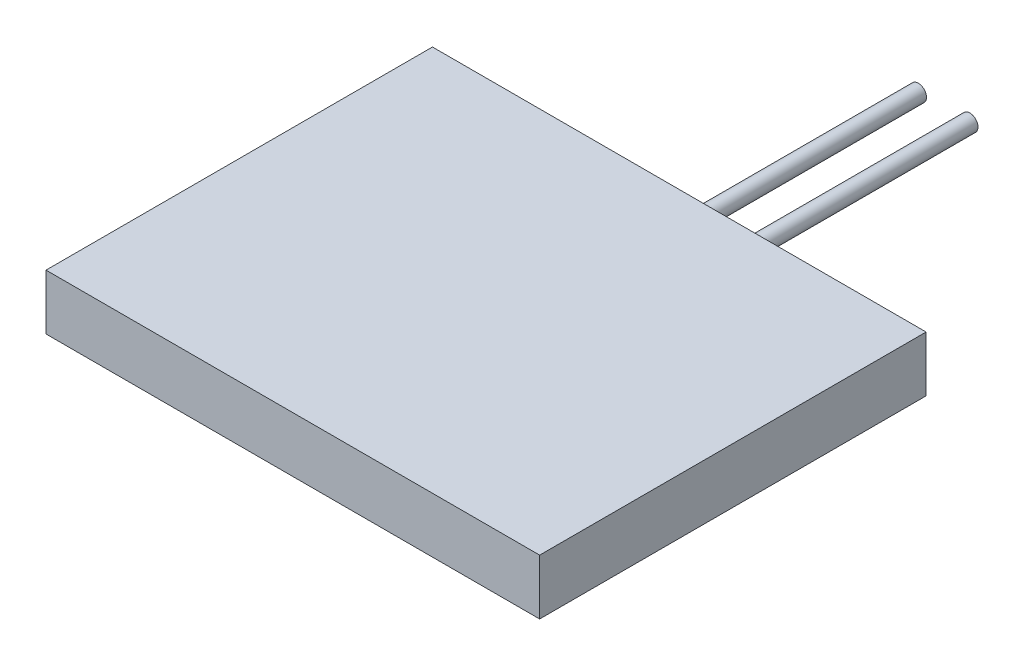
ISO-10303-21;
HEADER;
FILE_DESCRIPTION(('STEP AP214'),'2;1');
FILE_NAME('part.step','',(''),(''),'','','');
FILE_SCHEMA(('AUTOMOTIVE_DESIGN { 1 0 10303 214 1 1 1 1 }'));
ENDSEC;
DATA;
#1=APPLICATION_CONTEXT('core data for automotive mechanical design processes');
#2=APPLICATION_PROTOCOL_DEFINITION('international standard','automotive_design',2000,#1);
#3=PRODUCT_CONTEXT('',#1,'mechanical');
#4=PRODUCT('Part','Part','',(#3));
#5=PRODUCT_RELATED_PRODUCT_CATEGORY('part','',(#4));
#6=PRODUCT_DEFINITION_FORMATION('','',#4);
#7=PRODUCT_DEFINITION_CONTEXT('part definition',#1,'design');
#8=PRODUCT_DEFINITION('design','',#6,#7);
#9=PRODUCT_DEFINITION_SHAPE('','',#8);
#10=(LENGTH_UNIT() NAMED_UNIT(*) SI_UNIT(.MILLI.,.METRE.));
#11=(NAMED_UNIT(*) PLANE_ANGLE_UNIT() SI_UNIT($,.RADIAN.));
#12=(NAMED_UNIT(*) SI_UNIT($,.STERADIAN.) SOLID_ANGLE_UNIT());
#13=UNCERTAINTY_MEASURE_WITH_UNIT(LENGTH_MEASURE(1.E-05),#10,'distance_accuracy_value','');
#14=(GEOMETRIC_REPRESENTATION_CONTEXT(3) GLOBAL_UNCERTAINTY_ASSIGNED_CONTEXT((#13)) GLOBAL_UNIT_ASSIGNED_CONTEXT((#10,
#11,#12)) REPRESENTATION_CONTEXT('',''));
#15=CARTESIAN_POINT('',(0.,0.,0.));
#16=DIRECTION('',(0.,0.,1.));
#17=DIRECTION('',(1.,0.,0.));
#18=AXIS2_PLACEMENT_3D('',#15,#16,#17);
#19=CARTESIAN_POINT('',(0.,8.59984370744696,0.));
#20=DIRECTION('',(1.,0.,0.));
#21=DIRECTION('',(0.,0.,-1.));
#22=AXIS2_PLACEMENT_3D('',#19,#20,#21);
#23=PLANE('',#22);
#24=DIRECTION('',(0.,0.,1.));
#25=VECTOR('',#24,1.);
#26=CARTESIAN_POINT('',(0.,0.,0.));
#27=LINE('',#26,#25);
#28=CARTESIAN_POINT('',(0.,0.,0.));
#29=VERTEX_POINT('',#28);
#30=CARTESIAN_POINT('',(0.,0.,60.0682355852091));
#31=VERTEX_POINT('',#30);
#32=EDGE_CURVE('E106',#29,#31,#27,.T.);
#33=ORIENTED_EDGE('',*,*,#32,.T.);
#34=DIRECTION('',(0.,-1.,0.));
#35=VECTOR('',#34,1.);
#36=CARTESIAN_POINT('',(0.,8.59984370744696,60.0682355852091));
#37=LINE('',#36,#35);
#38=CARTESIAN_POINT('',(0.,8.59984370744696,60.0682355852091));
#39=VERTEX_POINT('',#38);
#40=EDGE_CURVE('E97',#39,#31,#37,.T.);
#41=ORIENTED_EDGE('',*,*,#40,.F.);
#42=DIRECTION('',(0.,0.,1.));
#43=VECTOR('',#42,1.);
#44=CARTESIAN_POINT('',(0.,8.59984370744696,0.));
#45=LINE('',#44,#43);
#46=CARTESIAN_POINT('',(0.,8.59984370744696,0.));
#47=VERTEX_POINT('',#46);
#48=EDGE_CURVE('E91',#47,#39,#45,.T.);
#49=ORIENTED_EDGE('',*,*,#48,.F.);
#50=DIRECTION('',(0.,-1.,0.));
#51=VECTOR('',#50,1.);
#52=CARTESIAN_POINT('',(0.,8.59984370744696,0.));
#53=LINE('',#52,#51);
#54=EDGE_CURVE('E102',#47,#29,#53,.T.);
#55=ORIENTED_EDGE('',*,*,#54,.T.);
#56=EDGE_LOOP('',(#33,#41,#49,#55));
#57=FACE_BOUND('',#56,.T.);
#58=ADVANCED_FACE('F39',(#57),#23,.F.);
#59=CARTESIAN_POINT('',(0.,8.59984370744696,60.0682355852091));
#60=DIRECTION('',(0.,0.,-1.));
#61=DIRECTION('',(-1.,0.,0.));
#62=AXIS2_PLACEMENT_3D('',#59,#60,#61);
#63=PLANE('',#62);
#64=DIRECTION('',(1.,0.,0.));
#65=VECTOR('',#64,1.);
#66=CARTESIAN_POINT('',(0.,0.,60.0682355852091));
#67=LINE('',#66,#65);
#68=CARTESIAN_POINT('',(76.7286707380878,0.,60.0682355852091));
#69=VERTEX_POINT('',#68);
#70=EDGE_CURVE('E96',#31,#69,#67,.T.);
#71=ORIENTED_EDGE('',*,*,#70,.T.);
#72=DIRECTION('',(0.,-1.,0.));
#73=VECTOR('',#72,1.);
#74=CARTESIAN_POINT('',(76.7286707380878,8.59984370744696,60.0682355852091));
#75=LINE('',#74,#73);
#76=CARTESIAN_POINT('',(76.7286707380878,8.59984370744696,60.0682355852091));
#77=VERTEX_POINT('',#76);
#78=EDGE_CURVE('E94',#77,#69,#75,.T.);
#79=ORIENTED_EDGE('',*,*,#78,.F.);
#80=DIRECTION('',(1.,0.,0.));
#81=VECTOR('',#80,1.);
#82=CARTESIAN_POINT('',(0.,8.59984370744696,60.0682355852091));
#83=LINE('',#82,#81);
#84=EDGE_CURVE('E86',#39,#77,#83,.T.);
#85=ORIENTED_EDGE('',*,*,#84,.F.);
#86=ORIENTED_EDGE('',*,*,#40,.T.);
#87=EDGE_LOOP('',(#71,#79,#85,#86));
#88=FACE_BOUND('',#87,.T.);
#89=ADVANCED_FACE('F95',(#88),#63,.F.);
#90=CARTESIAN_POINT('',(76.7286707380878,8.59984370744696,0.));
#91=DIRECTION('',(-1.,0.,0.));
#92=DIRECTION('',(0.,0.,1.));
#93=AXIS2_PLACEMENT_3D('',#90,#91,#92);
#94=PLANE('',#93);
#95=DIRECTION('',(0.,0.,-1.));
#96=VECTOR('',#95,1.);
#97=CARTESIAN_POINT('',(76.7286707380878,0.,0.));
#98=LINE('',#97,#96);
#99=CARTESIAN_POINT('',(76.7286707380878,0.,0.));
#100=VERTEX_POINT('',#99);
#101=EDGE_CURVE('E72',#69,#100,#98,.T.);
#102=ORIENTED_EDGE('',*,*,#101,.T.);
#103=DIRECTION('',(0.,-1.,0.));
#104=VECTOR('',#103,1.);
#105=CARTESIAN_POINT('',(76.7286707380878,8.59984370744696,0.));
#106=LINE('',#105,#104);
#107=CARTESIAN_POINT('',(76.7286707380878,8.59984370744696,0.));
#108=VERTEX_POINT('',#107);
#109=EDGE_CURVE('E98',#108,#100,#106,.T.);
#110=ORIENTED_EDGE('',*,*,#109,.F.);
#111=DIRECTION('',(0.,0.,-1.));
#112=VECTOR('',#111,1.);
#113=CARTESIAN_POINT('',(76.7286707380878,8.59984370744696,0.));
#114=LINE('',#113,#112);
#115=EDGE_CURVE('E89',#77,#108,#114,.T.);
#116=ORIENTED_EDGE('',*,*,#115,.F.);
#117=ORIENTED_EDGE('',*,*,#78,.T.);
#118=EDGE_LOOP('',(#102,#110,#116,#117));
#119=FACE_BOUND('',#118,.T.);
#120=ADVANCED_FACE('F100',(#119),#94,.F.);
#121=CARTESIAN_POINT('',(0.,8.59984370744696,0.));
#122=DIRECTION('',(0.,0.,1.));
#123=DIRECTION('',(1.,0.,0.));
#124=AXIS2_PLACEMENT_3D('',#121,#122,#123);
#125=PLANE('',#124);
#126=CARTESIAN_POINT('',(40.2143612260839,4.90986139361346,0.));
#127=DIRECTION('',(0.,0.,1.));
#128=DIRECTION('',(1.,0.,0.));
#129=AXIS2_PLACEMENT_3D('',#126,#127,#128);
#130=CIRCLE('',#129,1.27);
#131=CARTESIAN_POINT('',(41.4843612260839,4.90986139361346,0.));
#132=VERTEX_POINT('',#131);
#133=EDGE_CURVE('E11',#132,#132,#130,.F.);
#134=ORIENTED_EDGE('',*,*,#133,.F.);
#135=EDGE_LOOP('',(#134));
#136=FACE_BOUND('',#135,.T.);
#137=CARTESIAN_POINT('',(48.218554730012,4.90986139361346,0.));
#138=DIRECTION('',(0.,0.,1.));
#139=DIRECTION('',(1.,0.,0.));
#140=AXIS2_PLACEMENT_3D('',#137,#138,#139);
#141=CIRCLE('',#140,1.27);
#142=CARTESIAN_POINT('',(49.488554730012,4.90986139361346,0.));
#143=VERTEX_POINT('',#142);
#144=EDGE_CURVE('E47',#143,#143,#141,.F.);
#145=ORIENTED_EDGE('',*,*,#144,.F.);
#146=EDGE_LOOP('',(#145));
#147=FACE_BOUND('',#146,.T.);
#148=DIRECTION('',(-1.,0.,0.));
#149=VECTOR('',#148,1.);
#150=CARTESIAN_POINT('',(0.,0.,0.));
#151=LINE('',#150,#149);
#152=EDGE_CURVE('E78',#100,#29,#151,.T.);
#153=ORIENTED_EDGE('',*,*,#152,.T.);
#154=ORIENTED_EDGE('',*,*,#54,.F.);
#155=DIRECTION('',(-1.,0.,0.));
#156=VECTOR('',#155,1.);
#157=CARTESIAN_POINT('',(0.,8.59984370744696,0.));
#158=LINE('',#157,#156);
#159=EDGE_CURVE('E55',#108,#47,#158,.T.);
#160=ORIENTED_EDGE('',*,*,#159,.F.);
#161=ORIENTED_EDGE('',*,*,#109,.T.);
#162=EDGE_LOOP('',(#153,#154,#160,#161));
#163=FACE_BOUND('',#162,.T.);
#164=ADVANCED_FACE('F120',(#136,#147,#163),#125,.F.);
#165=CARTESIAN_POINT('',(0.,8.59984370744696,0.));
#166=DIRECTION('',(0.,1.,0.));
#167=DIRECTION('',(0.,0.,1.));
#168=AXIS2_PLACEMENT_3D('',#165,#166,#167);
#169=PLANE('',#168);
#170=ORIENTED_EDGE('',*,*,#48,.T.);
#171=ORIENTED_EDGE('',*,*,#84,.T.);
#172=ORIENTED_EDGE('',*,*,#115,.T.);
#173=ORIENTED_EDGE('',*,*,#159,.T.);
#174=EDGE_LOOP('',(#170,#171,#172,#173));
#175=FACE_BOUND('',#174,.T.);
#176=ADVANCED_FACE('F87',(#175),#169,.T.);
#177=CARTESIAN_POINT('',(0.,0.,0.));
#178=DIRECTION('',(0.,1.,0.));
#179=DIRECTION('',(0.,0.,1.));
#180=AXIS2_PLACEMENT_3D('',#177,#178,#179);
#181=PLANE('',#180);
#182=ORIENTED_EDGE('',*,*,#32,.F.);
#183=ORIENTED_EDGE('',*,*,#152,.F.);
#184=ORIENTED_EDGE('',*,*,#101,.F.);
#185=ORIENTED_EDGE('',*,*,#70,.F.);
#186=EDGE_LOOP('',(#182,#183,#184,#185));
#187=FACE_BOUND('',#186,.T.);
#188=ADVANCED_FACE('F128',(#187),#181,.F.);
#189=CARTESIAN_POINT('',(48.218554730012,4.90986139361346,-35.306));
#190=DIRECTION('',(0.,0.,1.));
#191=DIRECTION('',(1.,0.,0.));
#192=AXIS2_PLACEMENT_3D('',#189,#190,#191);
#193=CYLINDRICAL_SURFACE('',#192,1.27);
#194=CARTESIAN_POINT('',(48.218554730012,4.90986139361346,-35.306));
#195=DIRECTION('',(0.,0.,-1.));
#196=DIRECTION('',(-1.,0.,0.));
#197=AXIS2_PLACEMENT_3D('',#194,#195,#196);
#198=CIRCLE('',#197,1.27);
#199=CARTESIAN_POINT('',(46.948554730012,4.90986139361346,-35.306));
#200=VERTEX_POINT('',#199);
#201=EDGE_CURVE('E109',#200,#200,#198,.T.);
#202=ORIENTED_EDGE('',*,*,#201,.F.);
#203=EDGE_LOOP('',(#202));
#204=FACE_BOUND('',#203,.T.);
#205=ORIENTED_EDGE('',*,*,#144,.T.);
#206=EDGE_LOOP('',(#205));
#207=FACE_BOUND('',#206,.T.);
#208=ADVANCED_FACE('F118',(#204,#207),#193,.T.);
#209=CARTESIAN_POINT('',(48.218554730012,4.90986139361346,-35.306));
#210=DIRECTION('',(0.,0.,-1.));
#211=DIRECTION('',(-1.,0.,0.));
#212=AXIS2_PLACEMENT_3D('',#209,#210,#211);
#213=PLANE('',#212);
#214=ORIENTED_EDGE('',*,*,#201,.T.);
#215=EDGE_LOOP('',(#214));
#216=FACE_BOUND('',#215,.T.);
#217=ADVANCED_FACE('F144',(#216),#213,.T.);
#218=CARTESIAN_POINT('',(40.2143612260839,4.90986139361346,-35.306));
#219=DIRECTION('',(0.,0.,1.));
#220=DIRECTION('',(1.,0.,0.));
#221=AXIS2_PLACEMENT_3D('',#218,#219,#220);
#222=CYLINDRICAL_SURFACE('',#221,1.27);
#223=CARTESIAN_POINT('',(40.2143612260839,4.90986139361346,-35.306));
#224=DIRECTION('',(0.,0.,-1.));
#225=DIRECTION('',(-1.,0.,0.));
#226=AXIS2_PLACEMENT_3D('',#223,#224,#225);
#227=CIRCLE('',#226,1.27);
#228=CARTESIAN_POINT('',(38.9443612260839,4.90986139361346,-35.306));
#229=VERTEX_POINT('',#228);
#230=EDGE_CURVE('E162',#229,#229,#227,.T.);
#231=ORIENTED_EDGE('',*,*,#230,.F.);
#232=EDGE_LOOP('',(#231));
#233=FACE_BOUND('',#232,.T.);
#234=ORIENTED_EDGE('',*,*,#133,.T.);
#235=EDGE_LOOP('',(#234));
#236=FACE_BOUND('',#235,.T.);
#237=ADVANCED_FACE('F150',(#233,#236),#222,.T.);
#238=CARTESIAN_POINT('',(40.2143612260839,4.90986139361346,-35.306));
#239=DIRECTION('',(0.,0.,-1.));
#240=DIRECTION('',(-1.,0.,0.));
#241=AXIS2_PLACEMENT_3D('',#238,#239,#240);
#242=PLANE('',#241);
#243=ORIENTED_EDGE('',*,*,#230,.T.);
#244=EDGE_LOOP('',(#243));
#245=FACE_BOUND('',#244,.T.);
#246=ADVANCED_FACE('F154',(#245),#242,.T.);
#247=CLOSED_SHELL('',(#58,#89,#120,#164,#176,#188,#208,#217,#237,#246));
#248=MANIFOLD_SOLID_BREP('B2',#247);
#249=ADVANCED_BREP_SHAPE_REPRESENTATION('',(#18,#248),#14);
#250=SHAPE_DEFINITION_REPRESENTATION(#9,#249);
ENDSEC;
END-ISO-10303-21;
